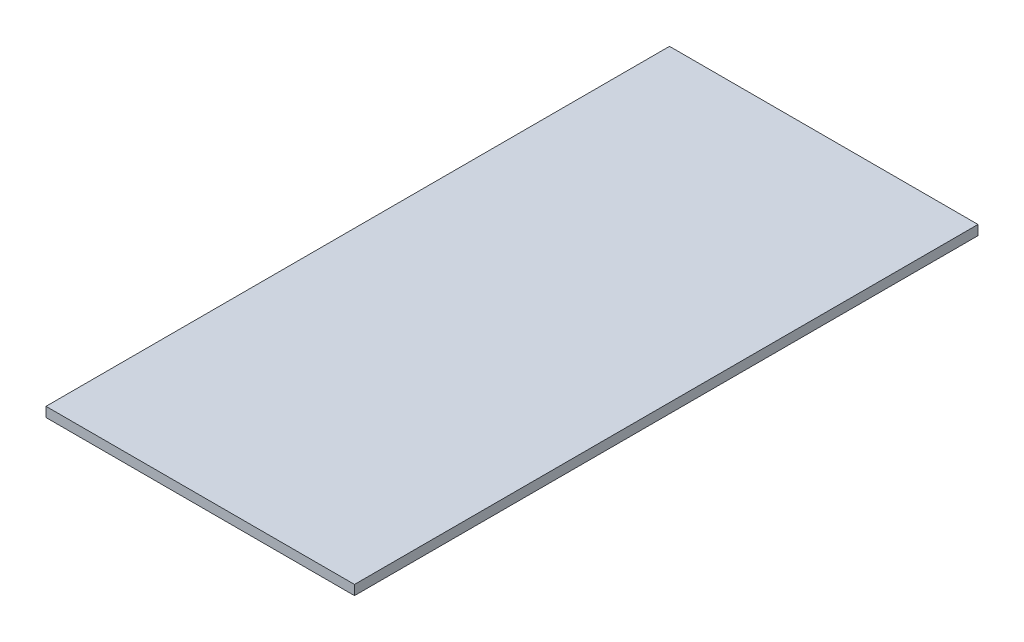
ISO-10303-21;
HEADER;
FILE_DESCRIPTION(('STEP AP214'),'2;1');
FILE_NAME('part.step','',(''),(''),'','','');
FILE_SCHEMA(('AUTOMOTIVE_DESIGN { 1 0 10303 214 1 1 1 1 }'));
ENDSEC;
DATA;
#1=APPLICATION_CONTEXT('core data for automotive mechanical design processes');
#2=APPLICATION_PROTOCOL_DEFINITION('international standard','automotive_design',2000,#1);
#3=PRODUCT_CONTEXT('',#1,'mechanical');
#4=PRODUCT('Part','Part','',(#3));
#5=PRODUCT_RELATED_PRODUCT_CATEGORY('part','',(#4));
#6=PRODUCT_DEFINITION_FORMATION('','',#4);
#7=PRODUCT_DEFINITION_CONTEXT('part definition',#1,'design');
#8=PRODUCT_DEFINITION('design','',#6,#7);
#9=PRODUCT_DEFINITION_SHAPE('','',#8);
#10=(LENGTH_UNIT() NAMED_UNIT(*) SI_UNIT(.MILLI.,.METRE.));
#11=(NAMED_UNIT(*) PLANE_ANGLE_UNIT() SI_UNIT($,.RADIAN.));
#12=(NAMED_UNIT(*) SI_UNIT($,.STERADIAN.) SOLID_ANGLE_UNIT());
#13=UNCERTAINTY_MEASURE_WITH_UNIT(LENGTH_MEASURE(1.E-05),#10,'distance_accuracy_value','');
#14=(GEOMETRIC_REPRESENTATION_CONTEXT(3) GLOBAL_UNCERTAINTY_ASSIGNED_CONTEXT((#13)) GLOBAL_UNIT_ASSIGNED_CONTEXT((#10,
#11,#12)) REPRESENTATION_CONTEXT('',''));
#15=CARTESIAN_POINT('',(0.,0.,0.));
#16=DIRECTION('',(0.,0.,1.));
#17=DIRECTION('',(1.,0.,0.));
#18=AXIS2_PLACEMENT_3D('',#15,#16,#17);
#19=CARTESIAN_POINT('',(0.,19.05,0.));
#20=DIRECTION('',(1.,0.,0.));
#21=DIRECTION('',(0.,0.,-1.));
#22=AXIS2_PLACEMENT_3D('',#19,#20,#21);
#23=PLANE('',#22);
#24=DIRECTION('',(0.,0.,1.));
#25=VECTOR('',#24,1.);
#26=CARTESIAN_POINT('',(0.,0.,0.));
#27=LINE('',#26,#25);
#28=CARTESIAN_POINT('',(0.,0.,-1219.2));
#29=VERTEX_POINT('',#28);
#30=CARTESIAN_POINT('',(0.,0.,0.));
#31=VERTEX_POINT('',#30);
#32=EDGE_CURVE('E102',#29,#31,#27,.T.);
#33=ORIENTED_EDGE('',*,*,#32,.T.);
#34=DIRECTION('',(0.,-1.,0.));
#35=VECTOR('',#34,1.);
#36=CARTESIAN_POINT('',(0.,19.05,0.));
#37=LINE('',#36,#35);
#38=CARTESIAN_POINT('',(0.,19.05,0.));
#39=VERTEX_POINT('',#38);
#40=EDGE_CURVE('E11',#39,#31,#37,.T.);
#41=ORIENTED_EDGE('',*,*,#40,.F.);
#42=DIRECTION('',(0.,0.,1.));
#43=VECTOR('',#42,1.);
#44=CARTESIAN_POINT('',(0.,19.05,0.));
#45=LINE('',#44,#43);
#46=CARTESIAN_POINT('',(0.,19.05,-1219.2));
#47=VERTEX_POINT('',#46);
#48=EDGE_CURVE('E90',#47,#39,#45,.T.);
#49=ORIENTED_EDGE('',*,*,#48,.F.);
#50=DIRECTION('',(0.,-1.,0.));
#51=VECTOR('',#50,1.);
#52=CARTESIAN_POINT('',(0.,19.05,-1219.2));
#53=LINE('',#52,#51);
#54=EDGE_CURVE('E98',#47,#29,#53,.T.);
#55=ORIENTED_EDGE('',*,*,#54,.T.);
#56=EDGE_LOOP('',(#33,#41,#49,#55));
#57=FACE_BOUND('',#56,.T.);
#58=ADVANCED_FACE('F39',(#57),#23,.F.);
#59=CARTESIAN_POINT('',(0.,19.05,0.));
#60=DIRECTION('',(0.,0.,-1.));
#61=DIRECTION('',(-1.,0.,0.));
#62=AXIS2_PLACEMENT_3D('',#59,#60,#61);
#63=PLANE('',#62);
#64=DIRECTION('',(1.,0.,0.));
#65=VECTOR('',#64,1.);
#66=CARTESIAN_POINT('',(0.,0.,0.));
#67=LINE('',#66,#65);
#68=CARTESIAN_POINT('',(603.25,0.,0.));
#69=VERTEX_POINT('',#68);
#70=EDGE_CURVE('E94',#31,#69,#67,.T.);
#71=ORIENTED_EDGE('',*,*,#70,.T.);
#72=DIRECTION('',(0.,-1.,0.));
#73=VECTOR('',#72,1.);
#74=CARTESIAN_POINT('',(603.25,19.05,0.));
#75=LINE('',#74,#73);
#76=CARTESIAN_POINT('',(603.25,19.05,0.));
#77=VERTEX_POINT('',#76);
#78=EDGE_CURVE('E47',#77,#69,#75,.T.);
#79=ORIENTED_EDGE('',*,*,#78,.F.);
#80=DIRECTION('',(1.,0.,0.));
#81=VECTOR('',#80,1.);
#82=CARTESIAN_POINT('',(0.,19.05,0.));
#83=LINE('',#82,#81);
#84=EDGE_CURVE('E85',#39,#77,#83,.T.);
#85=ORIENTED_EDGE('',*,*,#84,.F.);
#86=ORIENTED_EDGE('',*,*,#40,.T.);
#87=EDGE_LOOP('',(#71,#79,#85,#86));
#88=FACE_BOUND('',#87,.T.);
#89=ADVANCED_FACE('F93',(#88),#63,.F.);
#90=CARTESIAN_POINT('',(603.25,19.05,0.));
#91=DIRECTION('',(-1.,0.,0.));
#92=DIRECTION('',(0.,0.,1.));
#93=AXIS2_PLACEMENT_3D('',#90,#91,#92);
#94=PLANE('',#93);
#95=DIRECTION('',(0.,0.,-1.));
#96=VECTOR('',#95,1.);
#97=CARTESIAN_POINT('',(603.25,0.,0.));
#98=LINE('',#97,#96);
#99=CARTESIAN_POINT('',(603.25,0.,-1219.2));
#100=VERTEX_POINT('',#99);
#101=EDGE_CURVE('E72',#69,#100,#98,.T.);
#102=ORIENTED_EDGE('',*,*,#101,.T.);
#103=DIRECTION('',(0.,-1.,0.));
#104=VECTOR('',#103,1.);
#105=CARTESIAN_POINT('',(603.25,19.05,-1219.2));
#106=LINE('',#105,#104);
#107=CARTESIAN_POINT('',(603.25,19.05,-1219.2));
#108=VERTEX_POINT('',#107);
#109=EDGE_CURVE('E95',#108,#100,#106,.T.);
#110=ORIENTED_EDGE('',*,*,#109,.F.);
#111=DIRECTION('',(0.,0.,-1.));
#112=VECTOR('',#111,1.);
#113=CARTESIAN_POINT('',(603.25,19.05,0.));
#114=LINE('',#113,#112);
#115=EDGE_CURVE('E88',#77,#108,#114,.T.);
#116=ORIENTED_EDGE('',*,*,#115,.F.);
#117=ORIENTED_EDGE('',*,*,#78,.T.);
#118=EDGE_LOOP('',(#102,#110,#116,#117));
#119=FACE_BOUND('',#118,.T.);
#120=ADVANCED_FACE('F96',(#119),#94,.F.);
#121=CARTESIAN_POINT('',(0.,19.05,-1219.2));
#122=DIRECTION('',(0.,0.,1.));
#123=DIRECTION('',(1.,0.,0.));
#124=AXIS2_PLACEMENT_3D('',#121,#122,#123);
#125=PLANE('',#124);
#126=DIRECTION('',(-1.,0.,0.));
#127=VECTOR('',#126,1.);
#128=CARTESIAN_POINT('',(0.,0.,-1219.2));
#129=LINE('',#128,#127);
#130=EDGE_CURVE('E78',#100,#29,#129,.T.);
#131=ORIENTED_EDGE('',*,*,#130,.T.);
#132=ORIENTED_EDGE('',*,*,#54,.F.);
#133=DIRECTION('',(-1.,0.,0.));
#134=VECTOR('',#133,1.);
#135=CARTESIAN_POINT('',(0.,19.05,-1219.2));
#136=LINE('',#135,#134);
#137=EDGE_CURVE('E55',#108,#47,#136,.T.);
#138=ORIENTED_EDGE('',*,*,#137,.F.);
#139=ORIENTED_EDGE('',*,*,#109,.T.);
#140=EDGE_LOOP('',(#131,#132,#138,#139));
#141=FACE_BOUND('',#140,.T.);
#142=ADVANCED_FACE('F109',(#141),#125,.F.);
#143=CARTESIAN_POINT('',(0.,19.05,0.));
#144=DIRECTION('',(0.,-1.,0.));
#145=DIRECTION('',(0.,0.,-1.));
#146=AXIS2_PLACEMENT_3D('',#143,#144,#145);
#147=PLANE('',#146);
#148=ORIENTED_EDGE('',*,*,#48,.T.);
#149=ORIENTED_EDGE('',*,*,#84,.T.);
#150=ORIENTED_EDGE('',*,*,#115,.T.);
#151=ORIENTED_EDGE('',*,*,#137,.T.);
#152=EDGE_LOOP('',(#148,#149,#150,#151));
#153=FACE_BOUND('',#152,.T.);
#154=ADVANCED_FACE('F86',(#153),#147,.F.);
#155=CARTESIAN_POINT('',(0.,0.,0.));
#156=DIRECTION('',(0.,-1.,0.));
#157=DIRECTION('',(0.,0.,-1.));
#158=AXIS2_PLACEMENT_3D('',#155,#156,#157);
#159=PLANE('',#158);
#160=ORIENTED_EDGE('',*,*,#32,.F.);
#161=ORIENTED_EDGE('',*,*,#130,.F.);
#162=ORIENTED_EDGE('',*,*,#101,.F.);
#163=ORIENTED_EDGE('',*,*,#70,.F.);
#164=EDGE_LOOP('',(#160,#161,#162,#163));
#165=FACE_BOUND('',#164,.T.);
#166=ADVANCED_FACE('F112',(#165),#159,.T.);
#167=CLOSED_SHELL('',(#58,#89,#120,#142,#154,#166));
#168=MANIFOLD_SOLID_BREP('B2',#167);
#169=ADVANCED_BREP_SHAPE_REPRESENTATION('',(#18,#168),#14);
#170=SHAPE_DEFINITION_REPRESENTATION(#9,#169);
ENDSEC;
END-ISO-10303-21;
